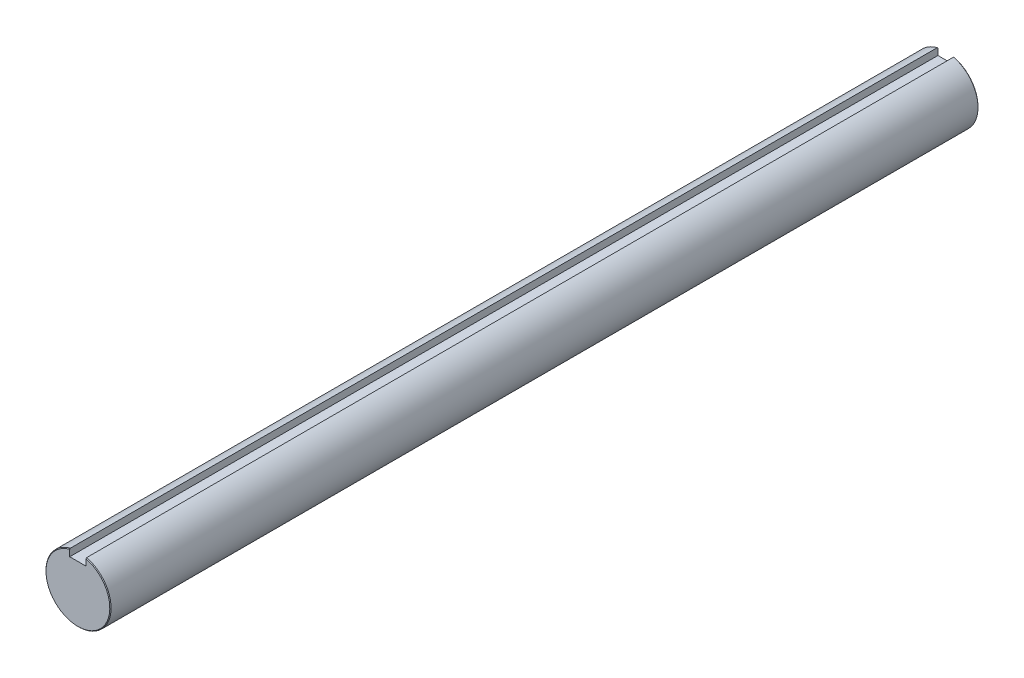
ISO-10303-21;
HEADER;
FILE_DESCRIPTION(('STEP AP214'),'2;1');
FILE_NAME('part.step','',(''),(''),'','','');
FILE_SCHEMA(('AUTOMOTIVE_DESIGN { 1 0 10303 214 1 1 1 1 }'));
ENDSEC;
DATA;
#1=APPLICATION_CONTEXT('core data for automotive mechanical design processes');
#2=APPLICATION_PROTOCOL_DEFINITION('international standard','automotive_design',2000,#1);
#3=PRODUCT_CONTEXT('',#1,'mechanical');
#4=PRODUCT('Part','Part','',(#3));
#5=PRODUCT_RELATED_PRODUCT_CATEGORY('part','',(#4));
#6=PRODUCT_DEFINITION_FORMATION('','',#4);
#7=PRODUCT_DEFINITION_CONTEXT('part definition',#1,'design');
#8=PRODUCT_DEFINITION('design','',#6,#7);
#9=PRODUCT_DEFINITION_SHAPE('','',#8);
#10=(LENGTH_UNIT() NAMED_UNIT(*) SI_UNIT(.MILLI.,.METRE.));
#11=(NAMED_UNIT(*) PLANE_ANGLE_UNIT() SI_UNIT($,.RADIAN.));
#12=(NAMED_UNIT(*) SI_UNIT($,.STERADIAN.) SOLID_ANGLE_UNIT());
#13=UNCERTAINTY_MEASURE_WITH_UNIT(LENGTH_MEASURE(1.E-05),#10,'distance_accuracy_value','');
#14=(GEOMETRIC_REPRESENTATION_CONTEXT(3) GLOBAL_UNCERTAINTY_ASSIGNED_CONTEXT((#13)) GLOBAL_UNIT_ASSIGNED_CONTEXT((#10,
#11,#12)) REPRESENTATION_CONTEXT('',''));
#15=CARTESIAN_POINT('',(0.,0.,0.));
#16=DIRECTION('',(0.,0.,1.));
#17=DIRECTION('',(1.,0.,0.));
#18=AXIS2_PLACEMENT_3D('',#15,#16,#17);
#19=CARTESIAN_POINT('',(0.,0.,127.));
#20=DIRECTION('',(0.,0.,-1.));
#21=DIRECTION('',(-1.,0.,0.));
#22=AXIS2_PLACEMENT_3D('',#19,#20,#21);
#23=CYLINDRICAL_SURFACE('',#22,9.52500000000016);
#24=DIRECTION('',(0.,0.,-1.));
#25=VECTOR('',#24,1.);
#26=CARTESIAN_POINT('',(-2.3876,9.22089969796891,127.));
#27=LINE('',#26,#25);
#28=CARTESIAN_POINT('',(-2.3876,9.22089969796891,126.8095));
#29=VERTEX_POINT('',#28);
#30=CARTESIAN_POINT('',(-2.3876,9.22089969796891,-126.8095));
#31=VERTEX_POINT('',#30);
#32=EDGE_CURVE('E127',#29,#31,#27,.T.);
#33=ORIENTED_EDGE('',*,*,#32,.T.);
#34=CARTESIAN_POINT('',(0.,0.,-126.8095));
#35=DIRECTION('',(0.,0.,1.));
#36=DIRECTION('',(1.,0.,0.));
#37=AXIS2_PLACEMENT_3D('',#34,#35,#36);
#38=CIRCLE('',#37,9.52500000000016);
#39=CARTESIAN_POINT('',(2.3876,9.22089969796891,-126.8095));
#40=VERTEX_POINT('',#39);
#41=EDGE_CURVE('E134',#31,#40,#38,.T.);
#42=ORIENTED_EDGE('',*,*,#41,.T.);
#43=DIRECTION('',(0.,0.,-1.));
#44=VECTOR('',#43,1.);
#45=CARTESIAN_POINT('',(2.3876,9.22089969796891,127.));
#46=LINE('',#45,#44);
#47=CARTESIAN_POINT('',(2.3876,9.22089969796891,126.8095));
#48=VERTEX_POINT('',#47);
#49=EDGE_CURVE('E114',#48,#40,#46,.T.);
#50=ORIENTED_EDGE('',*,*,#49,.F.);
#51=CARTESIAN_POINT('',(0.,0.,126.8095));
#52=DIRECTION('',(0.,0.,1.));
#53=DIRECTION('',(1.,0.,0.));
#54=AXIS2_PLACEMENT_3D('',#51,#52,#53);
#55=CIRCLE('',#54,9.52500000000016);
#56=EDGE_CURVE('E132',#48,#29,#55,.F.);
#57=ORIENTED_EDGE('',*,*,#56,.T.);
#58=EDGE_LOOP('',(#33,#42,#50,#57));
#59=FACE_BOUND('',#58,.T.);
#60=ADVANCED_FACE('F41',(#59),#23,.T.);
#61=CARTESIAN_POINT('',(2.3876,7.13740000000016,127.));
#62=DIRECTION('',(1.,0.,0.));
#63=DIRECTION('',(0.,0.,-1.));
#64=AXIS2_PLACEMENT_3D('',#61,#62,#63);
#65=PLANE('',#64);
#66=ORIENTED_EDGE('',*,*,#49,.T.);
#67=CARTESIAN_POINT('',(2.3876,9.22089969796891,-126.8095));
#68=CARTESIAN_POINT('',(2.3876,9.18809111074266,-126.841261349516));
#69=CARTESIAN_POINT('',(2.3876,9.1552770336901,-126.87301702427));
#70=CARTESIAN_POINT('',(2.3876,9.08963789991252,-126.93651702427));
#71=CARTESIAN_POINT('',(2.3876,9.0568128431875,-126.968261349516));
#72=CARTESIAN_POINT('',(2.3876,9.02398229663615,-127.));
#73=B_SPLINE_CURVE_WITH_KNOTS('',3,(#67,#68,#69,#70,#71,#72),.UNSPECIFIED.,.F.,.F.,(4,2,4),(0.,
0.136991528156478,0.273983056395681),.UNSPECIFIED.);
#74=CARTESIAN_POINT('',(2.3876,9.02398229663615,-127.));
#75=VERTEX_POINT('',#74);
#76=EDGE_CURVE('E105',#40,#75,#73,.T.);
#77=ORIENTED_EDGE('',*,*,#76,.T.);
#78=DIRECTION('',(0.,-1.,0.));
#79=VECTOR('',#78,1.);
#80=CARTESIAN_POINT('',(2.3876,7.13740000000016,-127.));
#81=LINE('',#80,#79);
#82=CARTESIAN_POINT('',(2.3876,7.13740000000016,-127.));
#83=VERTEX_POINT('',#82);
#84=EDGE_CURVE('E98',#75,#83,#81,.T.);
#85=ORIENTED_EDGE('',*,*,#84,.T.);
#86=DIRECTION('',(0.,0.,-1.));
#87=VECTOR('',#86,1.);
#88=CARTESIAN_POINT('',(2.3876,7.13740000000016,127.));
#89=LINE('',#88,#87);
#90=CARTESIAN_POINT('',(2.3876,7.13740000000016,127.));
#91=VERTEX_POINT('',#90);
#92=EDGE_CURVE('E103',#91,#83,#89,.T.);
#93=ORIENTED_EDGE('',*,*,#92,.F.);
#94=DIRECTION('',(0.,-1.,0.));
#95=VECTOR('',#94,1.);
#96=CARTESIAN_POINT('',(2.3876,7.13740000000016,127.));
#97=LINE('',#96,#95);
#98=CARTESIAN_POINT('',(2.3876,9.02398229663611,127.));
#99=VERTEX_POINT('',#98);
#100=EDGE_CURVE('E120',#99,#91,#97,.T.);
#101=ORIENTED_EDGE('',*,*,#100,.F.);
#102=CARTESIAN_POINT('',(2.3876,9.02398229663611,127.));
#103=CARTESIAN_POINT('',(2.3876,9.05681284318747,126.968261349516));
#104=CARTESIAN_POINT('',(2.3876,9.0896378999125,126.93651702427));
#105=CARTESIAN_POINT('',(2.3876,9.15527703369008,126.87301702427));
#106=CARTESIAN_POINT('',(2.3876,9.18809111074265,126.841261349516));
#107=CARTESIAN_POINT('',(2.3876,9.2208996979689,126.8095));
#108=B_SPLINE_CURVE_WITH_KNOTS('',3,(#102,#103,#104,#105,#106,#107),.UNSPECIFIED.,.F.,.F.,(4,2,
4),(0.,0.136991528239235,0.273983056395741),.UNSPECIFIED.);
#109=EDGE_CURVE('E137',#99,#48,#108,.T.);
#110=ORIENTED_EDGE('',*,*,#109,.T.);
#111=EDGE_LOOP('',(#66,#77,#85,#93,#101,#110));
#112=FACE_BOUND('',#111,.T.);
#113=ADVANCED_FACE('F101',(#112),#65,.F.);
#114=CARTESIAN_POINT('',(2.3876,7.13740000000016,127.));
#115=DIRECTION('',(0.,-1.,0.));
#116=DIRECTION('',(0.,0.,-1.));
#117=AXIS2_PLACEMENT_3D('',#114,#115,#116);
#118=PLANE('',#117);
#119=ORIENTED_EDGE('',*,*,#92,.T.);
#120=DIRECTION('',(-1.,0.,0.));
#121=VECTOR('',#120,1.);
#122=CARTESIAN_POINT('',(2.3876,7.13740000000016,-127.));
#123=LINE('',#122,#121);
#124=CARTESIAN_POINT('',(-2.3876,7.13740000000016,-127.));
#125=VERTEX_POINT('',#124);
#126=EDGE_CURVE('E107',#83,#125,#123,.T.);
#127=ORIENTED_EDGE('',*,*,#126,.T.);
#128=DIRECTION('',(0.,0.,-1.));
#129=VECTOR('',#128,1.);
#130=CARTESIAN_POINT('',(-2.3876,7.13740000000016,127.));
#131=LINE('',#130,#129);
#132=CARTESIAN_POINT('',(-2.3876,7.13740000000016,127.));
#133=VERTEX_POINT('',#132);
#134=EDGE_CURVE('E115',#133,#125,#131,.T.);
#135=ORIENTED_EDGE('',*,*,#134,.F.);
#136=DIRECTION('',(-1.,0.,0.));
#137=VECTOR('',#136,1.);
#138=CARTESIAN_POINT('',(2.3876,7.13740000000016,127.));
#139=LINE('',#138,#137);
#140=EDGE_CURVE('E113',#91,#133,#139,.T.);
#141=ORIENTED_EDGE('',*,*,#140,.F.);
#142=EDGE_LOOP('',(#119,#127,#135,#141));
#143=FACE_BOUND('',#142,.T.);
#144=ADVANCED_FACE('F111',(#143),#118,.F.);
#145=CARTESIAN_POINT('',(-2.3876,7.13740000000016,127.));
#146=DIRECTION('',(-1.,0.,0.));
#147=DIRECTION('',(0.,0.,1.));
#148=AXIS2_PLACEMENT_3D('',#145,#146,#147);
#149=PLANE('',#148);
#150=DIRECTION('',(0.,1.,0.));
#151=VECTOR('',#150,1.);
#152=CARTESIAN_POINT('',(-2.3876,7.13740000000016,-127.));
#153=LINE('',#152,#151);
#154=CARTESIAN_POINT('',(-2.3876,9.02398229663615,-127.));
#155=VERTEX_POINT('',#154);
#156=EDGE_CURVE('E118',#125,#155,#153,.T.);
#157=ORIENTED_EDGE('',*,*,#156,.T.);
#158=CARTESIAN_POINT('',(-2.3876,9.02398229663615,-127.));
#159=CARTESIAN_POINT('',(-2.3876,9.05681284318749,-126.968261349516));
#160=CARTESIAN_POINT('',(-2.3876,9.08963789991252,-126.93651702427));
#161=CARTESIAN_POINT('',(-2.3876,9.15527703369009,-126.87301702427));
#162=CARTESIAN_POINT('',(-2.3876,9.18809111074266,-126.841261349516));
#163=CARTESIAN_POINT('',(-2.3876,9.2208996979689,-126.8095));
#164=B_SPLINE_CURVE_WITH_KNOTS('',3,(#158,#159,#160,#161,#162,#163),.UNSPECIFIED.,.F.,.F.,(4,2,
4),(0.,0.136991528239205,0.273983056395681),.UNSPECIFIED.);
#165=EDGE_CURVE('E50',#155,#31,#164,.T.);
#166=ORIENTED_EDGE('',*,*,#165,.T.);
#167=ORIENTED_EDGE('',*,*,#32,.F.);
#168=CARTESIAN_POINT('',(-2.3876,9.22089969796891,126.8095));
#169=CARTESIAN_POINT('',(-2.3876,9.18809111074266,126.841261349516));
#170=CARTESIAN_POINT('',(-2.3876,9.15527703369009,126.87301702427));
#171=CARTESIAN_POINT('',(-2.3876,9.0896378999125,126.93651702427));
#172=CARTESIAN_POINT('',(-2.3876,9.05681284318747,126.968261349516));
#173=CARTESIAN_POINT('',(-2.3876,9.02398229663612,127.));
#174=B_SPLINE_CURVE_WITH_KNOTS('',3,(#168,#169,#170,#171,#172,#173),.UNSPECIFIED.,.F.,.F.,(4,2,
4),(0.,0.136991528156507,0.27398305639574),.UNSPECIFIED.);
#175=CARTESIAN_POINT('',(-2.3876,9.02398229663611,127.));
#176=VERTEX_POINT('',#175);
#177=EDGE_CURVE('E57',#29,#176,#174,.T.);
#178=ORIENTED_EDGE('',*,*,#177,.T.);
#179=DIRECTION('',(0.,1.,0.));
#180=VECTOR('',#179,1.);
#181=CARTESIAN_POINT('',(-2.3876,7.13740000000016,127.));
#182=LINE('',#181,#180);
#183=EDGE_CURVE('E125',#133,#176,#182,.T.);
#184=ORIENTED_EDGE('',*,*,#183,.F.);
#185=ORIENTED_EDGE('',*,*,#134,.T.);
#186=EDGE_LOOP('',(#157,#166,#167,#178,#184,#185));
#187=FACE_BOUND('',#186,.T.);
#188=ADVANCED_FACE('F171',(#187),#149,.F.);
#189=CARTESIAN_POINT('',(0.,0.,127.));
#190=DIRECTION('',(0.,0.,1.));
#191=DIRECTION('',(1.,0.,0.));
#192=AXIS2_PLACEMENT_3D('',#189,#190,#191);
#193=PLANE('',#192);
#194=ORIENTED_EDGE('',*,*,#183,.T.);
#195=CARTESIAN_POINT('',(0.,0.,127.));
#196=DIRECTION('',(0.,0.,1.));
#197=DIRECTION('',(1.,0.,0.));
#198=AXIS2_PLACEMENT_3D('',#195,#196,#197);
#199=CIRCLE('',#198,9.33450000000011);
#200=EDGE_CURVE('E11',#176,#99,#199,.T.);
#201=ORIENTED_EDGE('',*,*,#200,.T.);
#202=ORIENTED_EDGE('',*,*,#100,.T.);
#203=ORIENTED_EDGE('',*,*,#140,.T.);
#204=EDGE_LOOP('',(#194,#201,#202,#203));
#205=FACE_BOUND('',#204,.T.);
#206=ADVANCED_FACE('F175',(#205),#193,.T.);
#207=CARTESIAN_POINT('',(0.,0.,-127.));
#208=DIRECTION('',(0.,0.,1.));
#209=DIRECTION('',(1.,0.,0.));
#210=AXIS2_PLACEMENT_3D('',#207,#208,#209);
#211=PLANE('',#210);
#212=ORIENTED_EDGE('',*,*,#84,.F.);
#213=CARTESIAN_POINT('',(0.,0.,-127.));
#214=DIRECTION('',(0.,0.,1.));
#215=DIRECTION('',(1.,0.,0.));
#216=AXIS2_PLACEMENT_3D('',#213,#214,#215);
#217=CIRCLE('',#216,9.33450000000014);
#218=EDGE_CURVE('E65',#75,#155,#217,.F.);
#219=ORIENTED_EDGE('',*,*,#218,.T.);
#220=ORIENTED_EDGE('',*,*,#156,.F.);
#221=ORIENTED_EDGE('',*,*,#126,.F.);
#222=EDGE_LOOP('',(#212,#219,#220,#221));
#223=FACE_BOUND('',#222,.T.);
#224=ADVANCED_FACE('F117',(#223),#211,.F.);
#225=CARTESIAN_POINT('',(0.,0.,-126.8095));
#226=DIRECTION('',(0.,0.,1.));
#227=DIRECTION('',(1.,0.,0.));
#228=AXIS2_PLACEMENT_3D('',#225,#226,#227);
#229=CONICAL_SURFACE('',#228,9.52500000000016,0.785398163397558);
#230=ORIENTED_EDGE('',*,*,#165,.F.);
#231=ORIENTED_EDGE('',*,*,#218,.F.);
#232=ORIENTED_EDGE('',*,*,#76,.F.);
#233=ORIENTED_EDGE('',*,*,#41,.F.);
#234=EDGE_LOOP('',(#230,#231,#232,#233));
#235=FACE_BOUND('',#234,.T.);
#236=ADVANCED_FACE('F157',(#235),#229,.T.);
#237=CARTESIAN_POINT('',(0.,0.,127.));
#238=DIRECTION('',(0.,0.,-1.));
#239=DIRECTION('',(-1.,0.,0.));
#240=AXIS2_PLACEMENT_3D('',#237,#238,#239);
#241=CONICAL_SURFACE('',#240,9.33450000000011,0.785398163397485);
#242=ORIENTED_EDGE('',*,*,#177,.F.);
#243=ORIENTED_EDGE('',*,*,#56,.F.);
#244=ORIENTED_EDGE('',*,*,#109,.F.);
#245=ORIENTED_EDGE('',*,*,#200,.F.);
#246=EDGE_LOOP('',(#242,#243,#244,#245));
#247=FACE_BOUND('',#246,.T.);
#248=ADVANCED_FACE('F43',(#247),#241,.T.);
#249=CLOSED_SHELL('',(#60,#113,#144,#188,#206,#224,#236,#248));
#250=MANIFOLD_SOLID_BREP('B2',#249);
#251=ADVANCED_BREP_SHAPE_REPRESENTATION('',(#18,#250),#14);
#252=SHAPE_DEFINITION_REPRESENTATION(#9,#251);
ENDSEC;
END-ISO-10303-21;
